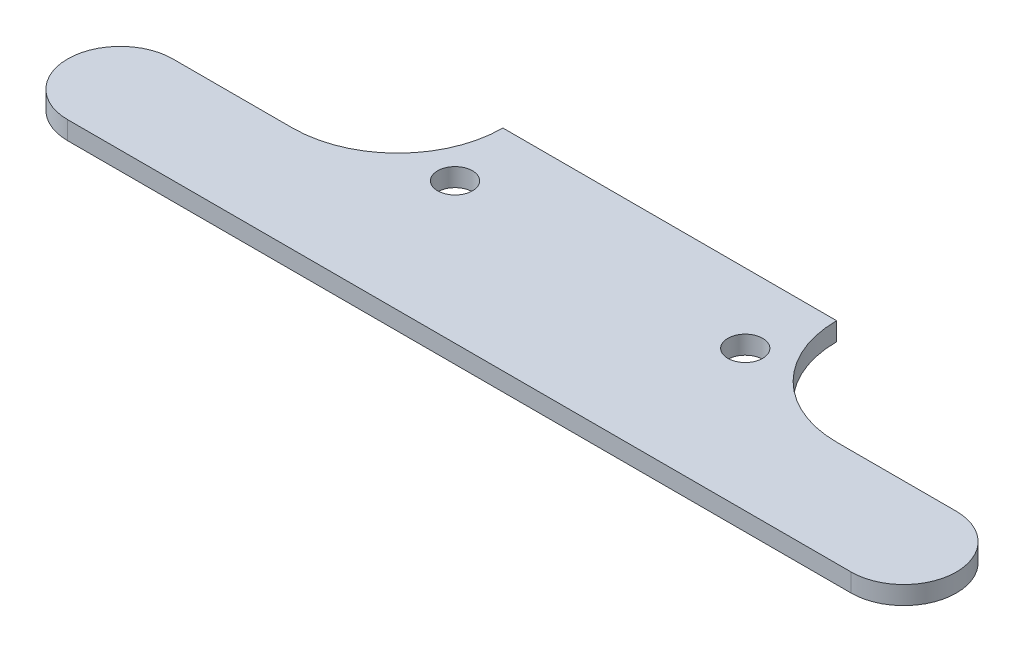
ISO-10303-21;
HEADER;
FILE_DESCRIPTION(('STEP AP214'),'2;1');
FILE_NAME('part.step','',(''),(''),'','','');
FILE_SCHEMA(('AUTOMOTIVE_DESIGN { 1 0 10303 214 1 1 1 1 }'));
ENDSEC;
DATA;
#1=APPLICATION_CONTEXT('core data for automotive mechanical design processes');
#2=APPLICATION_PROTOCOL_DEFINITION('international standard','automotive_design',2000,#1);
#3=PRODUCT_CONTEXT('',#1,'mechanical');
#4=PRODUCT('Part','Part','',(#3));
#5=PRODUCT_RELATED_PRODUCT_CATEGORY('part','',(#4));
#6=PRODUCT_DEFINITION_FORMATION('','',#4);
#7=PRODUCT_DEFINITION_CONTEXT('part definition',#1,'design');
#8=PRODUCT_DEFINITION('design','',#6,#7);
#9=PRODUCT_DEFINITION_SHAPE('','',#8);
#10=(LENGTH_UNIT() NAMED_UNIT(*) SI_UNIT(.MILLI.,.METRE.));
#11=(NAMED_UNIT(*) PLANE_ANGLE_UNIT() SI_UNIT($,.RADIAN.));
#12=(NAMED_UNIT(*) SI_UNIT($,.STERADIAN.) SOLID_ANGLE_UNIT());
#13=UNCERTAINTY_MEASURE_WITH_UNIT(LENGTH_MEASURE(1.E-05),#10,'distance_accuracy_value','');
#14=(GEOMETRIC_REPRESENTATION_CONTEXT(3) GLOBAL_UNCERTAINTY_ASSIGNED_CONTEXT((#13)) GLOBAL_UNIT_ASSIGNED_CONTEXT((#10,
#11,#12)) REPRESENTATION_CONTEXT('',''));
#15=CARTESIAN_POINT('',(0.,0.,0.));
#16=DIRECTION('',(0.,0.,1.));
#17=DIRECTION('',(1.,0.,0.));
#18=AXIS2_PLACEMENT_3D('',#15,#16,#17);
#19=CARTESIAN_POINT('',(0.,1.6,4.60374999999999));
#20=DIRECTION('',(0.,0.,-1.));
#21=DIRECTION('',(-1.,0.,0.));
#22=AXIS2_PLACEMENT_3D('',#19,#20,#21);
#23=PLANE('',#22);
#24=DIRECTION('',(1.,0.,0.));
#25=VECTOR('',#24,1.);
#26=CARTESIAN_POINT('',(0.,0.,4.60374999999999));
#27=LINE('',#26,#25);
#28=CARTESIAN_POINT('',(-34.29,0.,4.60375));
#29=VERTEX_POINT('',#28);
#30=CARTESIAN_POINT('',(34.29,0.,4.60374999999999));
#31=VERTEX_POINT('',#30);
#32=EDGE_CURVE('E194',#29,#31,#27,.T.);
#33=ORIENTED_EDGE('',*,*,#32,.T.);
#34=DIRECTION('',(0.,-1.,0.));
#35=VECTOR('',#34,1.);
#36=CARTESIAN_POINT('',(34.29,1.6,4.60374999999999));
#37=LINE('',#36,#35);
#38=CARTESIAN_POINT('',(34.29,1.6,4.60374999999999));
#39=VERTEX_POINT('',#38);
#40=EDGE_CURVE('E11',#39,#31,#37,.T.);
#41=ORIENTED_EDGE('',*,*,#40,.F.);
#42=DIRECTION('',(1.,0.,0.));
#43=VECTOR('',#42,1.);
#44=CARTESIAN_POINT('',(0.,1.6,4.60374999999999));
#45=LINE('',#44,#43);
#46=CARTESIAN_POINT('',(-34.29,1.6,4.60375));
#47=VERTEX_POINT('',#46);
#48=EDGE_CURVE('E151',#47,#39,#45,.T.);
#49=ORIENTED_EDGE('',*,*,#48,.F.);
#50=DIRECTION('',(0.,-1.,0.));
#51=VECTOR('',#50,1.);
#52=CARTESIAN_POINT('',(-34.29,1.6,4.60375));
#53=LINE('',#52,#51);
#54=EDGE_CURVE('E168',#47,#29,#53,.T.);
#55=ORIENTED_EDGE('',*,*,#54,.T.);
#56=EDGE_LOOP('',(#33,#41,#49,#55));
#57=FACE_BOUND('',#56,.T.);
#58=ADVANCED_FACE('F41',(#57),#23,.F.);
#59=CARTESIAN_POINT('',(34.29,1.6,0.));
#60=DIRECTION('',(0.,-1.,0.));
#61=DIRECTION('',(0.,0.,-1.));
#62=AXIS2_PLACEMENT_3D('',#59,#60,#61);
#63=CYLINDRICAL_SURFACE('',#62,4.60375);
#64=CARTESIAN_POINT('',(34.29,0.,0.));
#65=DIRECTION('',(0.,1.,0.));
#66=DIRECTION('',(0.,0.,1.));
#67=AXIS2_PLACEMENT_3D('',#64,#65,#66);
#68=CIRCLE('',#67,4.60375);
#69=CARTESIAN_POINT('',(34.29,0.,-4.60375000000001));
#70=VERTEX_POINT('',#69);
#71=EDGE_CURVE('E188',#31,#70,#68,.T.);
#72=ORIENTED_EDGE('',*,*,#71,.T.);
#73=DIRECTION('',(0.,-1.,0.));
#74=VECTOR('',#73,1.);
#75=CARTESIAN_POINT('',(34.29,1.6,-4.60375000000001));
#76=LINE('',#75,#74);
#77=CARTESIAN_POINT('',(34.29,1.6,-4.60375000000001));
#78=VERTEX_POINT('',#77);
#79=EDGE_CURVE('E50',#78,#70,#76,.T.);
#80=ORIENTED_EDGE('',*,*,#79,.F.);
#81=CARTESIAN_POINT('',(34.29,1.6,0.));
#82=DIRECTION('',(0.,1.,0.));
#83=DIRECTION('',(0.,0.,1.));
#84=AXIS2_PLACEMENT_3D('',#81,#82,#83);
#85=CIRCLE('',#84,4.60375);
#86=EDGE_CURVE('E97',#39,#78,#85,.T.);
#87=ORIENTED_EDGE('',*,*,#86,.F.);
#88=ORIENTED_EDGE('',*,*,#40,.T.);
#89=EDGE_LOOP('',(#72,#80,#87,#88));
#90=FACE_BOUND('',#89,.T.);
#91=ADVANCED_FACE('F189',(#90),#63,.T.);
#92=CARTESIAN_POINT('',(0.,1.6,-4.60375000000001));
#93=DIRECTION('',(0.,0.,-1.));
#94=DIRECTION('',(-1.,0.,0.));
#95=AXIS2_PLACEMENT_3D('',#92,#93,#94);
#96=PLANE('',#95);
#97=DIRECTION('',(1.,0.,0.));
#98=VECTOR('',#97,1.);
#99=CARTESIAN_POINT('',(0.,0.,-4.60375000000001));
#100=LINE('',#99,#98);
#101=CARTESIAN_POINT('',(23.8125,0.,-4.60375000000001));
#102=VERTEX_POINT('',#101);
#103=EDGE_CURVE('E186',#102,#70,#100,.T.);
#104=ORIENTED_EDGE('',*,*,#103,.F.);
#105=DIRECTION('',(0.,-1.,0.));
#106=VECTOR('',#105,1.);
#107=CARTESIAN_POINT('',(23.8125,1.6,-4.60375000000001));
#108=LINE('',#107,#106);
#109=CARTESIAN_POINT('',(23.8125,1.6,-4.60375000000001));
#110=VERTEX_POINT('',#109);
#111=EDGE_CURVE('E179',#110,#102,#108,.T.);
#112=ORIENTED_EDGE('',*,*,#111,.F.);
#113=DIRECTION('',(1.,0.,0.));
#114=VECTOR('',#113,1.);
#115=CARTESIAN_POINT('',(0.,1.6,-4.60375000000001));
#116=LINE('',#115,#114);
#117=EDGE_CURVE('E137',#110,#78,#116,.T.);
#118=ORIENTED_EDGE('',*,*,#117,.T.);
#119=ORIENTED_EDGE('',*,*,#79,.T.);
#120=EDGE_LOOP('',(#104,#112,#118,#119));
#121=FACE_BOUND('',#120,.T.);
#122=ADVANCED_FACE('F184',(#121),#96,.T.);
#123=CARTESIAN_POINT('',(23.8125,1.6,-13.81125));
#124=DIRECTION('',(0.,-1.,0.));
#125=DIRECTION('',(0.,0.,-1.));
#126=AXIS2_PLACEMENT_3D('',#123,#124,#125);
#127=CYLINDRICAL_SURFACE('',#126,9.2075);
#128=CARTESIAN_POINT('',(23.8125,0.,-13.81125));
#129=DIRECTION('',(0.,1.,0.));
#130=DIRECTION('',(0.,0.,1.));
#131=AXIS2_PLACEMENT_3D('',#128,#129,#130);
#132=CIRCLE('',#131,9.2075);
#133=CARTESIAN_POINT('',(14.605,0.,-13.81125));
#134=VERTEX_POINT('',#133);
#135=EDGE_CURVE('E200',#134,#102,#132,.T.);
#136=ORIENTED_EDGE('',*,*,#135,.F.);
#137=DIRECTION('',(0.,-1.,0.));
#138=VECTOR('',#137,1.);
#139=CARTESIAN_POINT('',(14.605,1.6,-13.81125));
#140=LINE('',#139,#138);
#141=CARTESIAN_POINT('',(14.605,1.6,-13.81125));
#142=VERTEX_POINT('',#141);
#143=EDGE_CURVE('E176',#142,#134,#140,.T.);
#144=ORIENTED_EDGE('',*,*,#143,.F.);
#145=CARTESIAN_POINT('',(23.8125,1.6,-13.81125));
#146=DIRECTION('',(0.,1.,0.));
#147=DIRECTION('',(0.,0.,1.));
#148=AXIS2_PLACEMENT_3D('',#145,#146,#147);
#149=CIRCLE('',#148,9.2075);
#150=EDGE_CURVE('E145',#142,#110,#149,.T.);
#151=ORIENTED_EDGE('',*,*,#150,.T.);
#152=ORIENTED_EDGE('',*,*,#111,.T.);
#153=EDGE_LOOP('',(#136,#144,#151,#152));
#154=FACE_BOUND('',#153,.T.);
#155=ADVANCED_FACE('F217',(#154),#127,.F.);
#156=CARTESIAN_POINT('',(0.,1.6,-13.81125));
#157=DIRECTION('',(0.,0.,-1.));
#158=DIRECTION('',(-1.,0.,0.));
#159=AXIS2_PLACEMENT_3D('',#156,#157,#158);
#160=PLANE('',#159);
#161=DIRECTION('',(1.,0.,0.));
#162=VECTOR('',#161,1.);
#163=CARTESIAN_POINT('',(0.,0.,-13.81125));
#164=LINE('',#163,#162);
#165=CARTESIAN_POINT('',(-14.605,0.,-13.81125));
#166=VERTEX_POINT('',#165);
#167=EDGE_CURVE('E205',#166,#134,#164,.T.);
#168=ORIENTED_EDGE('',*,*,#167,.F.);
#169=DIRECTION('',(0.,-1.,0.));
#170=VECTOR('',#169,1.);
#171=CARTESIAN_POINT('',(-14.605,1.6,-13.81125));
#172=LINE('',#171,#170);
#173=CARTESIAN_POINT('',(-14.605,1.6,-13.81125));
#174=VERTEX_POINT('',#173);
#175=EDGE_CURVE('E123',#174,#166,#172,.T.);
#176=ORIENTED_EDGE('',*,*,#175,.F.);
#177=DIRECTION('',(1.,0.,0.));
#178=VECTOR('',#177,1.);
#179=CARTESIAN_POINT('',(0.,1.6,-13.81125));
#180=LINE('',#179,#178);
#181=EDGE_CURVE('E131',#174,#142,#180,.T.);
#182=ORIENTED_EDGE('',*,*,#181,.T.);
#183=ORIENTED_EDGE('',*,*,#143,.T.);
#184=EDGE_LOOP('',(#168,#176,#182,#183));
#185=FACE_BOUND('',#184,.T.);
#186=ADVANCED_FACE('F215',(#185),#160,.T.);
#187=CARTESIAN_POINT('',(-23.8125,1.6,-13.81125));
#188=DIRECTION('',(0.,-1.,0.));
#189=DIRECTION('',(0.,0.,-1.));
#190=AXIS2_PLACEMENT_3D('',#187,#188,#189);
#191=CYLINDRICAL_SURFACE('',#190,9.2075);
#192=CARTESIAN_POINT('',(-23.8125,0.,-13.81125));
#193=DIRECTION('',(0.,1.,0.));
#194=DIRECTION('',(0.,0.,1.));
#195=AXIS2_PLACEMENT_3D('',#192,#193,#194);
#196=CIRCLE('',#195,9.2075);
#197=CARTESIAN_POINT('',(-23.8125,0.,-4.60375));
#198=VERTEX_POINT('',#197);
#199=EDGE_CURVE('E117',#198,#166,#196,.T.);
#200=ORIENTED_EDGE('',*,*,#199,.F.);
#201=DIRECTION('',(0.,-1.,0.));
#202=VECTOR('',#201,1.);
#203=CARTESIAN_POINT('',(-23.8125,1.6,-4.60375));
#204=LINE('',#203,#202);
#205=CARTESIAN_POINT('',(-23.8125,1.6,-4.60375));
#206=VERTEX_POINT('',#205);
#207=EDGE_CURVE('E112',#206,#198,#204,.T.);
#208=ORIENTED_EDGE('',*,*,#207,.F.);
#209=CARTESIAN_POINT('',(-23.8125,1.6,-13.81125));
#210=DIRECTION('',(0.,1.,0.));
#211=DIRECTION('',(0.,0.,1.));
#212=AXIS2_PLACEMENT_3D('',#209,#210,#211);
#213=CIRCLE('',#212,9.2075);
#214=EDGE_CURVE('E115',#206,#174,#213,.T.);
#215=ORIENTED_EDGE('',*,*,#214,.T.);
#216=ORIENTED_EDGE('',*,*,#175,.T.);
#217=EDGE_LOOP('',(#200,#208,#215,#216));
#218=FACE_BOUND('',#217,.T.);
#219=ADVANCED_FACE('F114',(#218),#191,.F.);
#220=CARTESIAN_POINT('',(-34.29,0.,-4.60375));
#221=VERTEX_POINT('',#220);
#222=EDGE_CURVE('E203',#221,#198,#100,.T.);
#223=ORIENTED_EDGE('',*,*,#222,.F.);
#224=DIRECTION('',(0.,-1.,0.));
#225=VECTOR('',#224,1.);
#226=CARTESIAN_POINT('',(-34.29,1.6,-4.60375));
#227=LINE('',#226,#225);
#228=CARTESIAN_POINT('',(-34.29,1.6,-4.60375));
#229=VERTEX_POINT('',#228);
#230=EDGE_CURVE('E86',#229,#221,#227,.T.);
#231=ORIENTED_EDGE('',*,*,#230,.F.);
#232=EDGE_CURVE('E128',#229,#206,#116,.T.);
#233=ORIENTED_EDGE('',*,*,#232,.T.);
#234=ORIENTED_EDGE('',*,*,#207,.T.);
#235=EDGE_LOOP('',(#223,#231,#233,#234));
#236=FACE_BOUND('',#235,.T.);
#237=ADVANCED_FACE('F134',(#236),#96,.T.);
#238=CARTESIAN_POINT('',(-12.7,1.6,-7.71524999999999));
#239=DIRECTION('',(0.,-1.,0.));
#240=DIRECTION('',(0.,0.,-1.));
#241=AXIS2_PLACEMENT_3D('',#238,#239,#240);
#242=CYLINDRICAL_SURFACE('',#241,1.524);
#243=CARTESIAN_POINT('',(-12.7,1.6,-7.71524999999999));
#244=DIRECTION('',(0.,1.,0.));
#245=DIRECTION('',(0.,0.,1.));
#246=AXIS2_PLACEMENT_3D('',#243,#244,#245);
#247=CIRCLE('',#246,1.524);
#248=CARTESIAN_POINT('',(-12.7,1.6,-6.19124999999999));
#249=VERTEX_POINT('',#248);
#250=EDGE_CURVE('E139',#249,#249,#247,.T.);
#251=ORIENTED_EDGE('',*,*,#250,.T.);
#252=EDGE_LOOP('',(#251));
#253=FACE_BOUND('',#252,.T.);
#254=CARTESIAN_POINT('',(-12.7,0.,-7.71524999999999));
#255=DIRECTION('',(0.,1.,0.));
#256=DIRECTION('',(0.,0.,1.));
#257=AXIS2_PLACEMENT_3D('',#254,#255,#256);
#258=CIRCLE('',#257,1.524);
#259=CARTESIAN_POINT('',(-12.7,0.,-6.19124999999999));
#260=VERTEX_POINT('',#259);
#261=EDGE_CURVE('E159',#260,#260,#258,.T.);
#262=ORIENTED_EDGE('',*,*,#261,.F.);
#263=EDGE_LOOP('',(#262));
#264=FACE_BOUND('',#263,.T.);
#265=ADVANCED_FACE('F243',(#253,#264),#242,.F.);
#266=CARTESIAN_POINT('',(-34.29,1.6,0.));
#267=DIRECTION('',(0.,-1.,0.));
#268=DIRECTION('',(0.,0.,-1.));
#269=AXIS2_PLACEMENT_3D('',#266,#267,#268);
#270=CYLINDRICAL_SURFACE('',#269,4.60375);
#271=CARTESIAN_POINT('',(-34.29,0.,0.));
#272=DIRECTION('',(0.,1.,0.));
#273=DIRECTION('',(0.,0.,1.));
#274=AXIS2_PLACEMENT_3D('',#271,#272,#273);
#275=CIRCLE('',#274,4.60375);
#276=EDGE_CURVE('E89',#221,#29,#275,.T.);
#277=ORIENTED_EDGE('',*,*,#276,.T.);
#278=ORIENTED_EDGE('',*,*,#54,.F.);
#279=CARTESIAN_POINT('',(-34.29,1.6,0.));
#280=DIRECTION('',(0.,1.,0.));
#281=DIRECTION('',(0.,0.,1.));
#282=AXIS2_PLACEMENT_3D('',#279,#280,#281);
#283=CIRCLE('',#282,4.60375);
#284=EDGE_CURVE('E58',#229,#47,#283,.T.);
#285=ORIENTED_EDGE('',*,*,#284,.F.);
#286=ORIENTED_EDGE('',*,*,#230,.T.);
#287=EDGE_LOOP('',(#277,#278,#285,#286));
#288=FACE_BOUND('',#287,.T.);
#289=ADVANCED_FACE('F252',(#288),#270,.T.);
#290=CARTESIAN_POINT('',(12.7,1.6,-7.71524999999999));
#291=DIRECTION('',(0.,-1.,0.));
#292=DIRECTION('',(0.,0.,-1.));
#293=AXIS2_PLACEMENT_3D('',#290,#291,#292);
#294=CYLINDRICAL_SURFACE('',#293,1.524);
#295=CARTESIAN_POINT('',(12.7,1.6,-7.71524999999999));
#296=DIRECTION('',(0.,1.,0.));
#297=DIRECTION('',(0.,0.,1.));
#298=AXIS2_PLACEMENT_3D('',#295,#296,#297);
#299=CIRCLE('',#298,1.524);
#300=CARTESIAN_POINT('',(12.7,1.6,-6.19124999999999));
#301=VERTEX_POINT('',#300);
#302=EDGE_CURVE('E171',#301,#301,#299,.F.);
#303=ORIENTED_EDGE('',*,*,#302,.F.);
#304=EDGE_LOOP('',(#303));
#305=FACE_BOUND('',#304,.T.);
#306=CARTESIAN_POINT('',(12.7,0.,-7.71524999999999));
#307=DIRECTION('',(0.,1.,0.));
#308=DIRECTION('',(0.,0.,1.));
#309=AXIS2_PLACEMENT_3D('',#306,#307,#308);
#310=CIRCLE('',#309,1.524);
#311=CARTESIAN_POINT('',(12.7,0.,-6.19124999999999));
#312=VERTEX_POINT('',#311);
#313=EDGE_CURVE('E153',#312,#312,#310,.F.);
#314=ORIENTED_EDGE('',*,*,#313,.T.);
#315=EDGE_LOOP('',(#314));
#316=FACE_BOUND('',#315,.T.);
#317=ADVANCED_FACE('F247',(#305,#316),#294,.F.);
#318=CARTESIAN_POINT('',(0.,1.6,0.));
#319=DIRECTION('',(0.,1.,0.));
#320=DIRECTION('',(0.,0.,1.));
#321=AXIS2_PLACEMENT_3D('',#318,#319,#320);
#322=PLANE('',#321);
#323=ORIENTED_EDGE('',*,*,#48,.T.);
#324=ORIENTED_EDGE('',*,*,#86,.T.);
#325=ORIENTED_EDGE('',*,*,#117,.F.);
#326=ORIENTED_EDGE('',*,*,#150,.F.);
#327=ORIENTED_EDGE('',*,*,#181,.F.);
#328=ORIENTED_EDGE('',*,*,#214,.F.);
#329=ORIENTED_EDGE('',*,*,#232,.F.);
#330=ORIENTED_EDGE('',*,*,#284,.T.);
#331=EDGE_LOOP('',(#323,#324,#325,#326,#327,#328,#329,#330));
#332=FACE_BOUND('',#331,.T.);
#333=ORIENTED_EDGE('',*,*,#250,.F.);
#334=EDGE_LOOP('',(#333));
#335=FACE_BOUND('',#334,.T.);
#336=ORIENTED_EDGE('',*,*,#302,.T.);
#337=EDGE_LOOP('',(#336));
#338=FACE_BOUND('',#337,.T.);
#339=ADVANCED_FACE('F126',(#332,#335,#338),#322,.T.);
#340=CARTESIAN_POINT('',(0.,0.,0.));
#341=DIRECTION('',(0.,1.,0.));
#342=DIRECTION('',(0.,0.,1.));
#343=AXIS2_PLACEMENT_3D('',#340,#341,#342);
#344=PLANE('',#343);
#345=ORIENTED_EDGE('',*,*,#32,.F.);
#346=ORIENTED_EDGE('',*,*,#276,.F.);
#347=ORIENTED_EDGE('',*,*,#222,.T.);
#348=ORIENTED_EDGE('',*,*,#199,.T.);
#349=ORIENTED_EDGE('',*,*,#167,.T.);
#350=ORIENTED_EDGE('',*,*,#135,.T.);
#351=ORIENTED_EDGE('',*,*,#103,.T.);
#352=ORIENTED_EDGE('',*,*,#71,.F.);
#353=EDGE_LOOP('',(#345,#346,#347,#348,#349,#350,#351,#352));
#354=FACE_BOUND('',#353,.T.);
#355=ORIENTED_EDGE('',*,*,#261,.T.);
#356=EDGE_LOOP('',(#355));
#357=FACE_BOUND('',#356,.T.);
#358=ORIENTED_EDGE('',*,*,#313,.F.);
#359=EDGE_LOOP('',(#358));
#360=FACE_BOUND('',#359,.T.);
#361=ADVANCED_FACE('F196',(#354,#357,#360),#344,.F.);
#362=CLOSED_SHELL('',(#58,#91,#122,#155,#186,#219,#237,#265,#289,#317,#339,#361));
#363=MANIFOLD_SOLID_BREP('B2',#362);
#364=ADVANCED_BREP_SHAPE_REPRESENTATION('',(#18,#363),#14);
#365=SHAPE_DEFINITION_REPRESENTATION(#9,#364);
ENDSEC;
END-ISO-10303-21;
